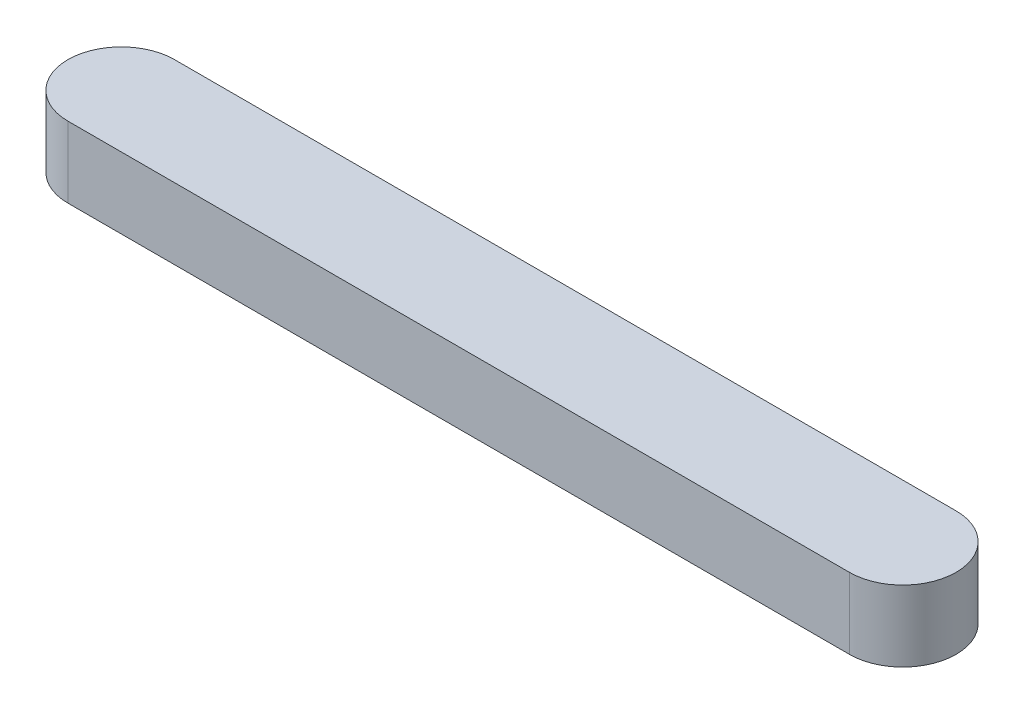
ISO-10303-21;
HEADER;
FILE_DESCRIPTION(('STEP AP214'),'2;1');
FILE_NAME('part.step','',(''),(''),'','','');
FILE_SCHEMA(('AUTOMOTIVE_DESIGN { 1 0 10303 214 1 1 1 1 }'));
ENDSEC;
DATA;
#1=APPLICATION_CONTEXT('core data for automotive mechanical design processes');
#2=APPLICATION_PROTOCOL_DEFINITION('international standard','automotive_design',2000,#1);
#3=PRODUCT_CONTEXT('',#1,'mechanical');
#4=PRODUCT('Part','Part','',(#3));
#5=PRODUCT_RELATED_PRODUCT_CATEGORY('part','',(#4));
#6=PRODUCT_DEFINITION_FORMATION('','',#4);
#7=PRODUCT_DEFINITION_CONTEXT('part definition',#1,'design');
#8=PRODUCT_DEFINITION('design','',#6,#7);
#9=PRODUCT_DEFINITION_SHAPE('','',#8);
#10=(LENGTH_UNIT() NAMED_UNIT(*) SI_UNIT(.MILLI.,.METRE.));
#11=(NAMED_UNIT(*) PLANE_ANGLE_UNIT() SI_UNIT($,.RADIAN.));
#12=(NAMED_UNIT(*) SI_UNIT($,.STERADIAN.) SOLID_ANGLE_UNIT());
#13=UNCERTAINTY_MEASURE_WITH_UNIT(LENGTH_MEASURE(1.E-05),#10,'distance_accuracy_value','');
#14=(GEOMETRIC_REPRESENTATION_CONTEXT(3) GLOBAL_UNCERTAINTY_ASSIGNED_CONTEXT((#13)) GLOBAL_UNIT_ASSIGNED_CONTEXT((#10,
#11,#12)) REPRESENTATION_CONTEXT('',''));
#15=CARTESIAN_POINT('',(0.,0.,0.));
#16=DIRECTION('',(0.,0.,1.));
#17=DIRECTION('',(1.,0.,0.));
#18=AXIS2_PLACEMENT_3D('',#15,#16,#17);
#19=CARTESIAN_POINT('',(-14.2702702702703,4.,0.));
#20=DIRECTION('',(0.,-1.,0.));
#21=DIRECTION('',(0.,0.,-1.));
#22=AXIS2_PLACEMENT_3D('',#19,#20,#21);
#23=CYLINDRICAL_SURFACE('',#22,6.);
#24=CARTESIAN_POINT('',(-14.2702702702703,-4.,0.));
#25=DIRECTION('',(0.,1.,0.));
#26=DIRECTION('',(0.,0.,1.));
#27=AXIS2_PLACEMENT_3D('',#24,#25,#26);
#28=CIRCLE('',#27,6.);
#29=CARTESIAN_POINT('',(-14.2702702702703,-4.,-6.));
#30=VERTEX_POINT('',#29);
#31=CARTESIAN_POINT('',(-14.2702702702703,-4.,6.));
#32=VERTEX_POINT('',#31);
#33=EDGE_CURVE('E93',#30,#32,#28,.T.);
#34=ORIENTED_EDGE('',*,*,#33,.T.);
#35=DIRECTION('',(0.,-1.,0.));
#36=VECTOR('',#35,1.);
#37=CARTESIAN_POINT('',(-14.2702702702703,4.,6.));
#38=LINE('',#37,#36);
#39=CARTESIAN_POINT('',(-14.2702702702703,4.,6.));
#40=VERTEX_POINT('',#39);
#41=EDGE_CURVE('E11',#40,#32,#38,.T.);
#42=ORIENTED_EDGE('',*,*,#41,.F.);
#43=CARTESIAN_POINT('',(-14.2702702702703,4.,0.));
#44=DIRECTION('',(0.,1.,0.));
#45=DIRECTION('',(0.,0.,1.));
#46=AXIS2_PLACEMENT_3D('',#43,#44,#45);
#47=CIRCLE('',#46,6.);
#48=CARTESIAN_POINT('',(-14.2702702702703,4.,-6.));
#49=VERTEX_POINT('',#48);
#50=EDGE_CURVE('E81',#49,#40,#47,.T.);
#51=ORIENTED_EDGE('',*,*,#50,.F.);
#52=DIRECTION('',(0.,-1.,0.));
#53=VECTOR('',#52,1.);
#54=CARTESIAN_POINT('',(-14.2702702702703,4.,-6.));
#55=LINE('',#54,#53);
#56=EDGE_CURVE('E89',#49,#30,#55,.T.);
#57=ORIENTED_EDGE('',*,*,#56,.T.);
#58=EDGE_LOOP('',(#34,#42,#51,#57));
#59=FACE_BOUND('',#58,.T.);
#60=ADVANCED_FACE('F30',(#59),#23,.T.);
#61=CARTESIAN_POINT('',(-14.2702702702703,4.,6.));
#62=DIRECTION('',(0.,0.,-1.));
#63=DIRECTION('',(-1.,0.,0.));
#64=AXIS2_PLACEMENT_3D('',#61,#62,#63);
#65=PLANE('',#64);
#66=DIRECTION('',(1.,0.,0.));
#67=VECTOR('',#66,1.);
#68=CARTESIAN_POINT('',(-14.2702702702703,-4.,6.));
#69=LINE('',#68,#67);
#70=CARTESIAN_POINT('',(73.7297297297297,-4.,6.));
#71=VERTEX_POINT('',#70);
#72=EDGE_CURVE('E85',#32,#71,#69,.T.);
#73=ORIENTED_EDGE('',*,*,#72,.T.);
#74=DIRECTION('',(0.,-1.,0.));
#75=VECTOR('',#74,1.);
#76=CARTESIAN_POINT('',(73.7297297297297,4.,6.));
#77=LINE('',#76,#75);
#78=CARTESIAN_POINT('',(73.7297297297297,4.,6.));
#79=VERTEX_POINT('',#78);
#80=EDGE_CURVE('E38',#79,#71,#77,.T.);
#81=ORIENTED_EDGE('',*,*,#80,.F.);
#82=DIRECTION('',(1.,0.,0.));
#83=VECTOR('',#82,1.);
#84=CARTESIAN_POINT('',(-14.2702702702703,4.,6.));
#85=LINE('',#84,#83);
#86=EDGE_CURVE('E76',#40,#79,#85,.T.);
#87=ORIENTED_EDGE('',*,*,#86,.F.);
#88=ORIENTED_EDGE('',*,*,#41,.T.);
#89=EDGE_LOOP('',(#73,#81,#87,#88));
#90=FACE_BOUND('',#89,.T.);
#91=ADVANCED_FACE('F84',(#90),#65,.F.);
#92=CARTESIAN_POINT('',(73.7297297297297,4.,0.));
#93=DIRECTION('',(0.,-1.,0.));
#94=DIRECTION('',(0.,0.,-1.));
#95=AXIS2_PLACEMENT_3D('',#92,#93,#94);
#96=CYLINDRICAL_SURFACE('',#95,6.);
#97=CARTESIAN_POINT('',(73.7297297297297,-4.,0.));
#98=DIRECTION('',(0.,1.,0.));
#99=DIRECTION('',(0.,0.,1.));
#100=AXIS2_PLACEMENT_3D('',#97,#98,#99);
#101=CIRCLE('',#100,6.);
#102=CARTESIAN_POINT('',(73.7297297297297,-4.,-6.));
#103=VERTEX_POINT('',#102);
#104=EDGE_CURVE('E63',#71,#103,#101,.T.);
#105=ORIENTED_EDGE('',*,*,#104,.T.);
#106=DIRECTION('',(0.,-1.,0.));
#107=VECTOR('',#106,1.);
#108=CARTESIAN_POINT('',(73.7297297297297,4.,-6.));
#109=LINE('',#108,#107);
#110=CARTESIAN_POINT('',(73.7297297297297,4.,-6.));
#111=VERTEX_POINT('',#110);
#112=EDGE_CURVE('E86',#111,#103,#109,.T.);
#113=ORIENTED_EDGE('',*,*,#112,.F.);
#114=CARTESIAN_POINT('',(73.7297297297297,4.,0.));
#115=DIRECTION('',(0.,1.,0.));
#116=DIRECTION('',(0.,0.,1.));
#117=AXIS2_PLACEMENT_3D('',#114,#115,#116);
#118=CIRCLE('',#117,6.);
#119=EDGE_CURVE('E79',#79,#111,#118,.T.);
#120=ORIENTED_EDGE('',*,*,#119,.F.);
#121=ORIENTED_EDGE('',*,*,#80,.T.);
#122=EDGE_LOOP('',(#105,#113,#120,#121));
#123=FACE_BOUND('',#122,.T.);
#124=ADVANCED_FACE('F87',(#123),#96,.T.);
#125=CARTESIAN_POINT('',(-14.2702702702703,4.,-6.));
#126=DIRECTION('',(0.,0.,1.));
#127=DIRECTION('',(1.,0.,0.));
#128=AXIS2_PLACEMENT_3D('',#125,#126,#127);
#129=PLANE('',#128);
#130=DIRECTION('',(-1.,0.,0.));
#131=VECTOR('',#130,1.);
#132=CARTESIAN_POINT('',(-14.2702702702703,-4.,-6.));
#133=LINE('',#132,#131);
#134=EDGE_CURVE('E69',#103,#30,#133,.T.);
#135=ORIENTED_EDGE('',*,*,#134,.T.);
#136=ORIENTED_EDGE('',*,*,#56,.F.);
#137=DIRECTION('',(-1.,0.,0.));
#138=VECTOR('',#137,1.);
#139=CARTESIAN_POINT('',(-14.2702702702703,4.,-6.));
#140=LINE('',#139,#138);
#141=EDGE_CURVE('E46',#111,#49,#140,.T.);
#142=ORIENTED_EDGE('',*,*,#141,.F.);
#143=ORIENTED_EDGE('',*,*,#112,.T.);
#144=EDGE_LOOP('',(#135,#136,#142,#143));
#145=FACE_BOUND('',#144,.T.);
#146=ADVANCED_FACE('F100',(#145),#129,.F.);
#147=CARTESIAN_POINT('',(-14.2702702702703,4.,0.));
#148=DIRECTION('',(0.,1.,0.));
#149=DIRECTION('',(0.,0.,1.));
#150=AXIS2_PLACEMENT_3D('',#147,#148,#149);
#151=PLANE('',#150);
#152=ORIENTED_EDGE('',*,*,#50,.T.);
#153=ORIENTED_EDGE('',*,*,#86,.T.);
#154=ORIENTED_EDGE('',*,*,#119,.T.);
#155=ORIENTED_EDGE('',*,*,#141,.T.);
#156=EDGE_LOOP('',(#152,#153,#154,#155));
#157=FACE_BOUND('',#156,.T.);
#158=ADVANCED_FACE('F77',(#157),#151,.T.);
#159=CARTESIAN_POINT('',(-14.2702702702703,-4.,0.));
#160=DIRECTION('',(0.,1.,0.));
#161=DIRECTION('',(0.,0.,1.));
#162=AXIS2_PLACEMENT_3D('',#159,#160,#161);
#163=PLANE('',#162);
#164=ORIENTED_EDGE('',*,*,#33,.F.);
#165=ORIENTED_EDGE('',*,*,#134,.F.);
#166=ORIENTED_EDGE('',*,*,#104,.F.);
#167=ORIENTED_EDGE('',*,*,#72,.F.);
#168=EDGE_LOOP('',(#164,#165,#166,#167));
#169=FACE_BOUND('',#168,.T.);
#170=ADVANCED_FACE('F103',(#169),#163,.F.);
#171=CLOSED_SHELL('',(#60,#91,#124,#146,#158,#170));
#172=MANIFOLD_SOLID_BREP('B2',#171);
#173=ADVANCED_BREP_SHAPE_REPRESENTATION('',(#18,#172),#14);
#174=SHAPE_DEFINITION_REPRESENTATION(#9,#173);
ENDSEC;
END-ISO-10303-21;
